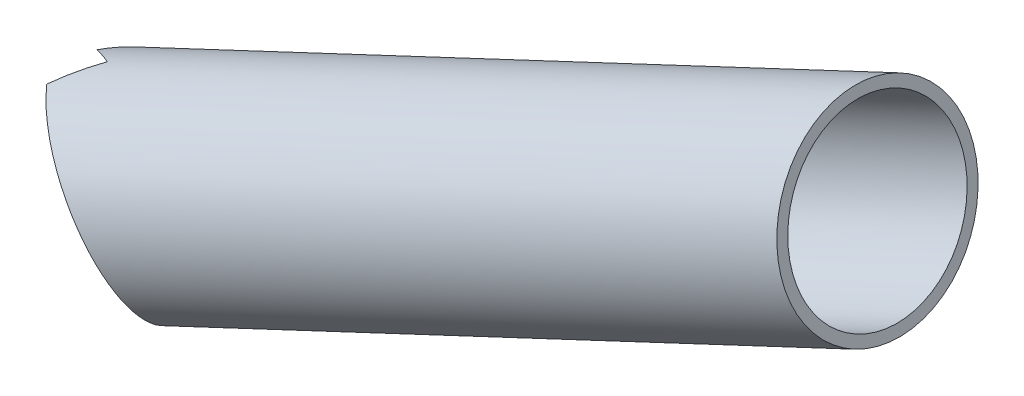
ISO-10303-21;
HEADER;
FILE_DESCRIPTION(('STEP AP214'),'2;1');
FILE_NAME('part.step','',(''),(''),'','','');
FILE_SCHEMA(('AUTOMOTIVE_DESIGN { 1 0 10303 214 1 1 1 1 }'));
ENDSEC;
DATA;
#1=APPLICATION_CONTEXT('core data for automotive mechanical design processes');
#2=APPLICATION_PROTOCOL_DEFINITION('international standard','automotive_design',2000,#1);
#3=PRODUCT_CONTEXT('',#1,'mechanical');
#4=PRODUCT('Part','Part','',(#3));
#5=PRODUCT_RELATED_PRODUCT_CATEGORY('part','',(#4));
#6=PRODUCT_DEFINITION_FORMATION('','',#4);
#7=PRODUCT_DEFINITION_CONTEXT('part definition',#1,'design');
#8=PRODUCT_DEFINITION('design','',#6,#7);
#9=PRODUCT_DEFINITION_SHAPE('','',#8);
#10=(LENGTH_UNIT() NAMED_UNIT(*) SI_UNIT(.MILLI.,.METRE.));
#11=(NAMED_UNIT(*) PLANE_ANGLE_UNIT() SI_UNIT($,.RADIAN.));
#12=(NAMED_UNIT(*) SI_UNIT($,.STERADIAN.) SOLID_ANGLE_UNIT());
#13=UNCERTAINTY_MEASURE_WITH_UNIT(LENGTH_MEASURE(1.E-05),#10,'distance_accuracy_value','');
#14=(GEOMETRIC_REPRESENTATION_CONTEXT(3) GLOBAL_UNCERTAINTY_ASSIGNED_CONTEXT((#13)) GLOBAL_UNIT_ASSIGNED_CONTEXT((#10,
#11,#12)) REPRESENTATION_CONTEXT('',''));
#15=CARTESIAN_POINT('',(0.,0.,0.));
#16=DIRECTION('',(0.,0.,1.));
#17=DIRECTION('',(1.,0.,0.));
#18=AXIS2_PLACEMENT_3D('',#15,#16,#17);
#19=CARTESIAN_POINT('',(-150.,499.999999999999,-1140.));
#20=DIRECTION('',(0.904818702200994,0.425797036329879,0.));
#21=DIRECTION('',(-0.425797036329879,0.904818702200994,0.));
#22=AXIS2_PLACEMENT_3D('',#19,#20,#21);
#23=CYLINDRICAL_SURFACE('',#22,9.79999999999998);
#24=CARTESIAN_POINT('',(-64.9999999999999,539.999999999999,-1140.));
#25=DIRECTION('',(0.975914622854119,0.218152810890676,0.));
#26=DIRECTION('',(-0.218152810890676,0.975914622854119,0.));
#27=AXIS2_PLACEMENT_3D('',#24,#25,#26);
#28=ELLIPSE('',#27,10.0418620343441,9.79999999999998);
#29=CARTESIAN_POINT('',(-67.1906604293684,549.799999999999,-1140.));
#30=VERTEX_POINT('',#29);
#31=EDGE_CURVE('E91',#30,#30,#28,.T.);
#32=ORIENTED_EDGE('',*,*,#31,.T.);
#33=EDGE_LOOP('',(#32));
#34=FACE_BOUND('',#33,.T.);
#35=CARTESIAN_POINT('',(-138.336732281427,501.299146111356,-1149.03718128588));
#36=CARTESIAN_POINT('',(-138.384109782549,501.107603912451,-1148.97293399458));
#37=CARTESIAN_POINT('',(-138.434346628037,500.917916336378,-1148.90534939631));
#38=CARTESIAN_POINT('',(-138.539913281016,500.542416929299,-1148.7638179233));
#39=CARTESIAN_POINT('',(-138.595241977368,500.356604263521,-1148.68987243686));
#40=CARTESIAN_POINT('',(-138.710372086181,499.988987744089,-1148.53592426282));
#41=CARTESIAN_POINT('',(-138.770172276178,499.807182812233,-1148.45592323069));
#42=CARTESIAN_POINT('',(-138.893673155196,499.447627793085,-1148.29003767371));
#43=CARTESIAN_POINT('',(-138.957374070782,499.269877942151,-1148.20415280709));
#44=CARTESIAN_POINT('',(-139.153825821032,498.741876961192,-1147.93738142296));
#45=CARTESIAN_POINT('',(-139.291615312254,498.397847071443,-1147.7477864734));
#46=CARTESIAN_POINT('',(-139.57572163373,497.727394240218,-1147.34544038017));
#47=CARTESIAN_POINT('',(-139.722036930919,497.400968153523,-1147.13269339364));
#48=CARTESIAN_POINT('',(-139.950661082281,496.910340755046,-1146.78386617308));
#49=CARTESIAN_POINT('',(-140.032041704513,496.739438502688,-1146.65654059522));
#50=CARTESIAN_POINT('',(-140.194365856337,496.403822656739,-1146.3937114018));
#51=CARTESIAN_POINT('',(-140.275309426939,496.239108473556,-1146.25820856859));
#52=CARTESIAN_POINT('',(-140.435269439397,495.916446829234,-1145.97812295777));
#53=CARTESIAN_POINT('',(-140.514285072907,495.758502186121,-1145.83353645939));
#54=CARTESIAN_POINT('',(-140.66836681663,495.450464881985,-1145.53421188882));
#55=CARTESIAN_POINT('',(-140.743433571272,495.300370939805,-1145.37947548234));
#56=CARTESIAN_POINT('',(-140.8698428819,495.044328599867,-1145.09681231914));
#57=CARTESIAN_POINT('',(-140.922570084574,494.936397367509,-1144.97130724133));
#58=CARTESIAN_POINT('',(-141.022745519367,494.72698374187,-1144.71295129274));
#59=CARTESIAN_POINT('',(-141.070193487935,494.625501670657,-1144.58010005572));
#60=CARTESIAN_POINT('',(-141.15793490945,494.430630767345,-1144.30692109174));
#61=CARTESIAN_POINT('',(-141.198249228381,494.337218754685,-1144.16661678466));
#62=CARTESIAN_POINT('',(-141.26995057508,494.159897893305,-1143.87797284965));
#63=CARTESIAN_POINT('',(-141.301342934248,494.07598338738,-1143.72963808376));
#64=CARTESIAN_POINT('',(-141.347303838552,493.937823215201,-1143.4607313347));
#65=CARTESIAN_POINT('',(-141.364088319109,493.88122140646,-1143.34174822431));
#66=CARTESIAN_POINT('',(-141.390678531993,493.775639243531,-1143.099741564));
#67=CARTESIAN_POINT('',(-141.400488059221,493.7266547563,-1142.97672024934));
#68=CARTESIAN_POINT('',(-141.412785788239,493.637036390859,-1142.72736039369));
#69=CARTESIAN_POINT('',(-141.415276739653,493.596399381801,-1142.60102311652));
#70=CARTESIAN_POINT('',(-141.412990748526,493.523931591068,-1142.3459105694));
#71=CARTESIAN_POINT('',(-141.408213497327,493.492101183449,-1142.21713519614));
#72=CARTESIAN_POINT('',(-141.391869289207,493.437507707597,-1141.95865098935));
#73=CARTESIAN_POINT('',(-141.380329456989,493.414709021996,-1141.8289479183));
#74=CARTESIAN_POINT('',(-141.351236309292,493.377816562473,-1141.56895962746));
#75=CARTESIAN_POINT('',(-141.333680413293,493.363726531308,-1141.43867418156));
#76=CARTESIAN_POINT('',(-141.273333628975,493.333928228905,-1141.04773668461));
#77=CARTESIAN_POINT('',(-141.222882505429,493.330742352202,-1140.78725175076));
#78=CARTESIAN_POINT('',(-141.116678588816,493.351790979125,-1140.30343581381));
#79=CARTESIAN_POINT('',(-141.06240469889,493.37260644476,-1140.07957463281));
#80=CARTESIAN_POINT('',(-140.948681119689,493.433253383847,-1139.63565295896));
#81=CARTESIAN_POINT('',(-140.889227692982,493.473098683266,-1139.4155953502));
#82=CARTESIAN_POINT('',(-140.768429845456,493.569576889879,-1138.97903926638));
#83=CARTESIAN_POINT('',(-140.707080233731,493.626260373711,-1138.76255361831));
#84=CARTESIAN_POINT('',(-140.585306943385,493.754539107633,-1138.33385760049));
#85=CARTESIAN_POINT('',(-140.52488314064,493.82613233962,-1138.1216466564));
#86=CARTESIAN_POINT('',(-140.38457393457,494.012733069873,-1137.62146505655));
#87=CARTESIAN_POINT('',(-140.306033384434,494.133893651101,-1137.3353976641));
#88=CARTESIAN_POINT('',(-140.158813234301,494.399598187824,-1136.77162256489));
#89=CARTESIAN_POINT('',(-140.090137032202,494.544150164487,-1136.49391776464));
#90=CARTESIAN_POINT('',(-139.966050916874,494.85465186944,-1135.94813957733));
#91=CARTESIAN_POINT('',(-139.910623551443,495.020573000356,-1135.68005391963));
#92=CARTESIAN_POINT('',(-139.815725812232,495.372514235599,-1135.15450818514));
#93=CARTESIAN_POINT('',(-139.77625108119,495.55852883403,-1134.89704522417));
#94=CARTESIAN_POINT('',(-139.720574421837,495.917784490671,-1134.43506653046));
#95=CARTESIAN_POINT('',(-139.701644887835,496.08824291451,-1134.22871112874));
#96=CARTESIAN_POINT('',(-139.677999290444,496.441501023387,-1133.82600834396));
#97=CARTESIAN_POINT('',(-139.673280716276,496.624298522533,-1133.62965919903));
#98=CARTESIAN_POINT('',(-139.679189248526,497.001212712988,-1133.24847083722));
#99=CARTESIAN_POINT('',(-139.689811712888,497.195325963202,-1133.06362815623));
#100=CARTESIAN_POINT('',(-139.72734287811,497.593747421134,-1132.70700138034));
#101=CARTESIAN_POINT('',(-139.754251705322,497.798055707936,-1132.53521738675));
#102=CARTESIAN_POINT('',(-139.825307380399,498.216870298143,-1132.20529448174));
#103=CARTESIAN_POINT('',(-139.86957001237,498.431436417195,-1132.04725612005));
#104=CARTESIAN_POINT('',(-139.975743242526,498.867768451591,-1131.74788165695));
#105=CARTESIAN_POINT('',(-140.037654049417,499.089534452053,-1131.60654575309));
#106=CARTESIAN_POINT('',(-140.17913343238,499.538193376268,-1131.34229140873));
#107=CARTESIAN_POINT('',(-140.258692675098,499.765083533361,-1131.21936329065));
#108=CARTESIAN_POINT('',(-140.435124558774,500.221950393892,-1130.99327873866));
#109=CARTESIAN_POINT('',(-140.531995120511,500.451926723592,-1130.89011993338));
#110=CARTESIAN_POINT('',(-140.729921307743,500.885685015895,-1130.7155663093));
#111=CARTESIAN_POINT('',(-140.829154026388,501.089376165319,-1130.64186521179));
#112=CARTESIAN_POINT('',(-141.039699649425,501.495877975374,-1130.51125662004));
#113=CARTESIAN_POINT('',(-141.1510114463,501.698688714957,-1130.45434758793));
#114=CARTESIAN_POINT('',(-141.384718272532,502.101949087778,-1130.35760347387));
#115=CARTESIAN_POINT('',(-141.507112472077,502.302398896526,-1130.31776711487));
#116=CARTESIAN_POINT('',(-141.761845980118,502.699608321355,-1130.25519549696));
#117=CARTESIAN_POINT('',(-141.894185512907,502.896367854085,-1130.23246062386));
#118=CARTESIAN_POINT('',(-142.165133751504,503.281567527469,-1130.20416002853));
#119=CARTESIAN_POINT('',(-142.303590472553,503.4700932238,-1130.198298193));
#120=CARTESIAN_POINT('',(-142.587689921144,503.841550764897,-1130.20255114103));
#121=CARTESIAN_POINT('',(-142.733335154833,504.024480622252,-1130.21267153518));
#122=CARTESIAN_POINT('',(-143.030439891601,504.383840200172,-1130.24841679835));
#123=CARTESIAN_POINT('',(-143.181896866452,504.560272683211,-1130.27403499553));
#124=CARTESIAN_POINT('',(-143.489494968056,504.906220088448,-1130.34022612203));
#125=CARTESIAN_POINT('',(-143.64563807618,505.07573201094,-1130.38080546138));
#126=CARTESIAN_POINT('',(-143.977831875718,505.424709209585,-1130.48131889087));
#127=CARTESIAN_POINT('',(-144.154257442382,505.603362807276,-1130.54283271095));
#128=CARTESIAN_POINT('',(-144.509583322142,505.951300125166,-1130.68255864086));
#129=CARTESIAN_POINT('',(-144.688482996794,506.12058620827,-1130.7607665153));
#130=CARTESIAN_POINT('',(-145.047523456281,506.450052055816,-1130.93330007403));
#131=CARTESIAN_POINT('',(-145.227665861119,506.610215429646,-1131.02765362059));
#132=CARTESIAN_POINT('',(-145.587204554633,506.921199718396,-1131.23171970656));
#133=CARTESIAN_POINT('',(-145.766600995042,507.072022629627,-1131.34142894758));
#134=CARTESIAN_POINT('',(-146.152667284849,507.389064734939,-1131.59526030083));
#135=CARTESIAN_POINT('',(-146.358904286496,507.553665618834,-1131.74207073006));
#136=CARTESIAN_POINT('',(-146.765068680726,507.871534156218,-1132.05557247906));
#137=CARTESIAN_POINT('',(-146.964993521092,508.024797258268,-1132.22227171359));
#138=CARTESIAN_POINT('',(-147.354372029067,508.321005987237,-1132.57530646318));
#139=CARTESIAN_POINT('',(-147.543838773257,508.463964570452,-1132.76161656861));
#140=CARTESIAN_POINT('',(-147.907228057707,508.741392350299,-1133.15431032563));
#141=CARTESIAN_POINT('',(-148.081163346731,508.8758684825,-1133.36067721782));
#142=CARTESIAN_POINT('',(-148.412918309111,509.1441278914,-1133.80327272173));
#143=CARTESIAN_POINT('',(-148.569810919142,509.277666711291,-1134.04036745157));
#144=CARTESIAN_POINT('',(-148.777338062252,509.475114660886,-1134.41268892875));
#145=CARTESIAN_POINT('',(-148.841846475094,509.540413559266,-1134.53949058014));
#146=CARTESIAN_POINT('',(-148.959744813563,509.670438653079,-1134.79840590481));
#147=CARTESIAN_POINT('',(-149.013141524125,509.735165174753,-1134.93051627738));
#148=CARTESIAN_POINT('',(-149.099825862611,509.854533092843,-1135.17913969417));
#149=CARTESIAN_POINT('',(-149.134932608085,509.909221170316,-1135.29499480444));
#150=CARTESIAN_POINT('',(-149.194659894054,510.018378942217,-1135.52943519284));
#151=CARTESIAN_POINT('',(-149.219285424401,510.072848728305,-1135.64801914341));
#152=CARTESIAN_POINT('',(-149.257235105689,510.181454040522,-1135.88698628407));
#153=CARTESIAN_POINT('',(-149.270571562427,510.235589866596,-1136.00736736906));
#154=CARTESIAN_POINT('',(-149.285613699637,510.34339253966,-1136.24906563634));
#155=CARTESIAN_POINT('',(-149.287319198416,510.397059379309,-1136.37038283322));
#156=CARTESIAN_POINT('',(-149.279250401041,510.503531475811,-1136.61269195166));
#157=CARTESIAN_POINT('',(-149.269500970609,510.556338347535,-1136.73368400845));
#158=CARTESIAN_POINT('',(-149.239194858499,510.660914563714,-1136.97478131758));
#159=CARTESIAN_POINT('',(-149.21863360642,510.712683459777,-1137.0948861731));
#160=CARTESIAN_POINT('',(-149.142064306163,510.866114659875,-1137.45316716174));
#161=CARTESIAN_POINT('',(-149.071181560786,510.965799469893,-1137.68907746012));
#162=CARTESIAN_POINT('',(-148.908237783641,511.147716998076,-1138.12754211656));
#163=CARTESIAN_POINT('',(-148.819216630602,511.230679727555,-1138.3309821867));
#164=CARTESIAN_POINT('',(-148.622739390114,511.390236315637,-1138.73148939223));
#165=CARTESIAN_POINT('',(-148.515268100475,511.466824844258,-1138.92855111167));
#166=CARTESIAN_POINT('',(-148.285605799954,511.613622842151,-1139.31836808921));
#167=CARTESIAN_POINT('',(-148.163314715713,511.683782603359,-1139.5110823079));
#168=CARTESIAN_POINT('',(-147.907959803507,511.816771431814,-1139.89176388563));
#169=CARTESIAN_POINT('',(-147.77489694554,511.879601157888,-1140.07973167009));
#170=CARTESIAN_POINT('',(-147.489542550938,512.00228732185,-1140.46653095151));
#171=CARTESIAN_POINT('',(-147.33656212829,512.061518678894,-1140.66505038945));
#172=CARTESIAN_POINT('',(-147.022946416122,512.17070207489,-1141.05860951802));
#173=CARTESIAN_POINT('',(-146.862309531261,512.220652169234,-1141.25364847169));
#174=CARTESIAN_POINT('',(-146.534866700256,512.31081658541,-1141.64101948947));
#175=CARTESIAN_POINT('',(-146.368056350982,512.351023797774,-1141.83334948102));
#176=CARTESIAN_POINT('',(-146.029593390326,512.421100018271,-1142.21561693414));
#177=CARTESIAN_POINT('',(-145.857940792191,512.450969054685,-1142.40555440225));
#178=CARTESIAN_POINT('',(-145.515978549459,512.498992899382,-1142.77765278441));
#179=CARTESIAN_POINT('',(-145.345782599279,512.517471692971,-1142.9598762548));
#180=CARTESIAN_POINT('',(-145.002559391186,512.543409660717,-1143.32240883479));
#181=CARTESIAN_POINT('',(-144.829532392462,512.550869838004,-1143.50271811718));
#182=CARTESIAN_POINT('',(-144.481508322448,512.554000971222,-1143.86125054756));
#183=CARTESIAN_POINT('',(-144.306513082177,512.549682105982,-1144.03947536315));
#184=CARTESIAN_POINT('',(-143.955080934561,512.528371299434,-1144.39384073409));
#185=CARTESIAN_POINT('',(-143.778643564301,512.511375117003,-1144.56998057188));
#186=CARTESIAN_POINT('',(-143.601881633929,512.487588485425,-1144.7449399659));
#187=B_SPLINE_CURVE_WITH_KNOTS('',3,(#35,#36,#37,#38,#39,#40,#41,#42,#43,#44,#45,#46,#47,#48,
#49,#50,#51,#52,#53,#54,#55,#56,#57,#58,#59,#60,#61,#62,#63,#64,#65,#66,#67,#68,#69,#70,#71,#72,
#73,#74,#75,#76,#77,#78,#79,#80,#81,#82,#83,#84,#85,#86,#87,#88,#89,#90,#91,#92,#93,#94,#95,#96,
#97,#98,#99,#100,#101,#102,#103,#104,#105,#106,#107,#108,#109,#110,#111,#112,#113,#114,#115,
#116,#117,#118,#119,#120,#121,#122,#123,#124,#125,#126,#127,#128,#129,#130,#131,#132,#133,#134,
#135,#136,#137,#138,#139,#140,#141,#142,#143,#144,#145,#146,#147,#148,#149,#150,#151,#152,#153,
#154,#155,#156,#157,#158,#159,#160,#161,#162,#163,#164,#165,#166,#167,#168,#169,#170,#171,#172,
#173,#174,#175,#176,#177,#178,#179,#180,#181,#182,#183,#184,#185,#186),.UNSPECIFIED.,.F.,.F.,(4,
2,2,2,2,2,2,2,2,2,2,2,2,2,2,2,2,2,2,2,2,2,2,2,2,2,2,2,2,2,2,2,2,2,2,2,2,2,2,2,2,2,2,2,2,2,2,2,2,
2,2,2,2,2,2,2,2,2,2,2,2,2,2,2,2,2,2,2,2,2,2,2,2,2,2,4),(0.,0.622439566958445,1.24474362652316,
1.86687817201632,2.48904888751746,3.73668036522004,4.98408818870272,5.66828335120571,
6.35241315835265,7.03682504298889,7.72112488776553,8.24201521392334,8.76293153257506,
9.28229803091212,9.80135352124916,10.1994106881417,10.5972511159027,10.9949420540164,
11.3926498812977,11.7887733169389,12.185066878141,12.9784082256457,13.671351916645,
14.3647998277685,15.0603520712831,15.7558102296968,16.7159379080137,17.6763955252002,
18.635580907627,19.594504123171,20.3986853129396,21.2027244123918,22.0065202679844,
22.8103223595747,23.6195812456197,24.4288497022689,25.2376911942563,26.0464356034497,
26.7603404808185,27.4741799563301,28.1879660261317,28.9017681985033,29.60296477507,
30.3044075624976,31.0055485923562,31.7069903721784,32.4817518507352,33.2563170005305,
34.032232536879,34.8079816625349,35.712907290195,36.6181942417072,37.5223223316636,
38.4257013251282,39.3653399861501,39.8345665276575,40.3035057078038,40.701618055668,
41.0995406594149,41.4970289420156,41.8945234339633,42.2911566587592,42.6879576843323,
43.4823128814373,44.192498422446,44.903271962022,45.6191448728801,46.3349533910024,
47.1072036552805,47.8796155392942,48.6525893732081,49.4255610924961,50.1753872326419,
50.9251451046147,51.6742552804987,52.423616179329),.UNSPECIFIED.);
#188=CARTESIAN_POINT('',(-141.320591496933,493.357491951229,-1141.35457940892));
#189=VERTEX_POINT('',#188);
#190=CARTESIAN_POINT('',(-147.810808037471,511.861066686141,-1140.02674104806));
#191=VERTEX_POINT('',#190);
#192=EDGE_CURVE('E83',#189,#191,#187,.T.);
#193=ORIENTED_EDGE('',*,*,#192,.T.);
#194=CARTESIAN_POINT('',(-145.166809343206,512.727009569949,-1137.43244739321));
#195=CARTESIAN_POINT('',(-145.317586623332,512.69442281405,-1137.56037692525));
#196=CARTESIAN_POINT('',(-145.467120842229,512.659648894768,-1137.68922644219));
#197=CARTESIAN_POINT('',(-145.763253034068,512.585868058034,-1137.94913540009));
#198=CARTESIAN_POINT('',(-145.909850353182,512.546860210139,-1138.08019532143));
#199=CARTESIAN_POINT('',(-146.20079507228,512.464426400729,-1138.34593805173));
#200=CARTESIAN_POINT('',(-146.345113671274,512.420966433929,-1138.48064191045));
#201=CARTESIAN_POINT('',(-146.62956741496,512.330029869832,-1138.75306534433));
#202=CARTESIAN_POINT('',(-146.769702844945,512.282553547301,-1138.89078471272));
#203=CARTESIAN_POINT('',(-147.052448978068,512.180996096573,-1139.17740418858));
#204=CARTESIAN_POINT('',(-147.194778958147,512.126696091507,-1139.32650476827));
#205=CARTESIAN_POINT('',(-147.472563613681,512.013837809595,-1139.62951520709));
#206=CARTESIAN_POINT('',(-147.608016910162,511.955278684355,-1139.78342602089));
#207=CARTESIAN_POINT('',(-147.869775865997,511.834209879729,-1140.09642368117));
#208=CARTESIAN_POINT('',(-147.996111163215,511.771714362971,-1140.25549107293));
#209=CARTESIAN_POINT('',(-148.237682010634,511.642716011877,-1140.58023024677));
#210=CARTESIAN_POINT('',(-148.352923818656,511.576215471597,-1140.74589822999));
#211=CARTESIAN_POINT('',(-148.544692348507,511.454806486202,-1141.04645886904));
#212=CARTESIAN_POINT('',(-148.624079485351,511.400679089818,-1141.17983486621));
#213=CARTESIAN_POINT('',(-148.772504018297,511.290170408017,-1141.45141296606));
#214=CARTESIAN_POINT('',(-148.841539876438,511.233788789248,-1141.58961578213));
#215=CARTESIAN_POINT('',(-148.966483420868,511.119568521706,-1141.86919329454));
#216=CARTESIAN_POINT('',(-149.022529464223,511.061753259811,-1142.01051513973));
#217=CARTESIAN_POINT('',(-149.120453798913,510.9442720026,-1142.297254745));
#218=CARTESIAN_POINT('',(-149.162335906439,510.884606510529,-1142.44267139036));
#219=CARTESIAN_POINT('',(-149.225339850178,510.772480882488,-1142.71504986442));
#220=CARTESIAN_POINT('',(-149.248599396986,510.7202399598,-1142.84160788567));
#221=CARTESIAN_POINT('',(-149.283008565666,510.614704189503,-1143.09591942452));
#222=CARTESIAN_POINT('',(-149.294159616899,510.561409467047,-1143.22367279921));
#223=CARTESIAN_POINT('',(-149.304299764433,510.453736362476,-1143.47951051949));
#224=CARTESIAN_POINT('',(-149.30326365894,510.399355967049,-1143.60759500313));
#225=CARTESIAN_POINT('',(-149.289451161879,510.289617203664,-1143.86271927275));
#226=CARTESIAN_POINT('',(-149.276671861436,510.234258596728,-1143.98975879203));
#227=CARTESIAN_POINT('',(-149.235452467052,510.107728543845,-1144.27507588567));
#228=CARTESIAN_POINT('',(-149.203768432373,510.036241018779,-1144.43274552741));
#229=CARTESIAN_POINT('',(-149.125397304491,509.891256809735,-1144.74334215198));
#230=CARTESIAN_POINT('',(-149.078705210532,509.817759463554,-1144.89626753535));
#231=CARTESIAN_POINT('',(-148.972634515461,509.668125549409,-1145.19684703044));
#232=CARTESIAN_POINT('',(-148.913221404332,509.591982283862,-1145.34448550183));
#233=CARTESIAN_POINT('',(-148.784023543284,509.436768479402,-1145.63357332562));
#234=CARTESIAN_POINT('',(-148.714235233032,509.35769694265,-1145.77502053178));
#235=CARTESIAN_POINT('',(-148.52657152432,509.152894090813,-1146.12553052865));
#236=CARTESIAN_POINT('',(-148.402970366449,509.024868669907,-1146.33020114489));
#237=CARTESIAN_POINT('',(-148.141454951273,508.759535729286,-1146.72380864397));
#238=CARTESIAN_POINT('',(-148.003533754041,508.622223720351,-1146.91273781733));
#239=CARTESIAN_POINT('',(-147.717472113123,508.337355170455,-1147.27453476867));
#240=CARTESIAN_POINT('',(-147.569328966348,508.189795919649,-1147.44739826967));
#241=CARTESIAN_POINT('',(-147.266061164232,507.883872333657,-1147.77655896599));
#242=CARTESIAN_POINT('',(-147.110937603405,507.725509690423,-1147.93285874565));
#243=CARTESIAN_POINT('',(-146.79115479051,507.392319936093,-1148.23315341612));
#244=CARTESIAN_POINT('',(-146.626349410688,507.21712578707,-1148.37658615857));
#245=CARTESIAN_POINT('',(-146.29441609869,506.854795321708,-1148.64446532561));
#246=CARTESIAN_POINT('',(-146.127288063756,506.667658475679,-1148.76891090723));
#247=CARTESIAN_POINT('',(-145.792939082886,506.281772667539,-1148.99787881483));
#248=CARTESIAN_POINT('',(-145.62571819614,506.083028131626,-1149.10240867104));
#249=CARTESIAN_POINT('',(-145.293137445893,505.674417592604,-1149.2906605201));
#250=CARTESIAN_POINT('',(-145.127777573675,505.464551641612,-1149.37438261045));
#251=CARTESIAN_POINT('',(-144.796477647132,505.028809808217,-1149.52203537007));
#252=CARTESIAN_POINT('',(-144.630639758753,504.802656204132,-1149.58537859043));
#253=CARTESIAN_POINT('',(-144.304957228149,504.340780528047,-1149.6882412777));
#254=CARTESIAN_POINT('',(-144.145112795562,504.10505812195,-1149.727759912));
#255=CARTESIAN_POINT('',(-143.833402674301,503.625740905835,-1149.78222860708));
#256=CARTESIAN_POINT('',(-143.681534046879,503.382149049576,-1149.79718777935));
#257=CARTESIAN_POINT('',(-143.387520146412,502.888928493683,-1149.80209023605));
#258=CARTESIAN_POINT('',(-143.245373821151,502.639300451298,-1149.79203623199));
#259=CARTESIAN_POINT('',(-142.985625016718,502.160511243029,-1149.74896806435));
#260=CARTESIAN_POINT('',(-142.8669783534,501.931705279461,-1149.71826825602));
#261=CARTESIAN_POINT('',(-142.63996148486,501.47264852847,-1149.63650078788));
#262=CARTESIAN_POINT('',(-142.531590556515,501.242397843933,-1149.58543456261));
#263=CARTESIAN_POINT('',(-142.325987051523,500.782286085418,-1149.46334466969));
#264=CARTESIAN_POINT('',(-142.228751976196,500.552424935484,-1149.39232549151));
#265=CARTESIAN_POINT('',(-142.046016771479,500.094837263342,-1149.23095710114));
#266=CARTESIAN_POINT('',(-141.960516585866,499.867110730912,-1149.14060798157));
#267=CARTESIAN_POINT('',(-141.804795271394,499.424507707271,-1148.94537116876));
#268=CARTESIAN_POINT('',(-141.73410309319,499.209479512826,-1148.84120108045));
#269=CARTESIAN_POINT('',(-141.604050279966,498.784511816816,-1148.61670061332));
#270=CARTESIAN_POINT('',(-141.54468922357,498.574572126276,-1148.49637083572));
#271=CARTESIAN_POINT('',(-141.437247560038,498.161192480017,-1148.24054778283));
#272=CARTESIAN_POINT('',(-141.389165682066,497.957751794283,-1148.10505621837));
#273=CARTESIAN_POINT('',(-141.304024739585,497.558625776724,-1147.81993351139));
#274=CARTESIAN_POINT('',(-141.266966109079,497.362940750516,-1147.67030181246));
#275=CARTESIAN_POINT('',(-141.201882790914,496.971112121611,-1147.35027132142));
#276=CARTESIAN_POINT('',(-141.174391471914,496.775418444374,-1147.17921337805));
#277=CARTESIAN_POINT('',(-141.130364108684,496.395132997708,-1146.82386949127));
#278=CARTESIAN_POINT('',(-141.113828486286,496.210541656005,-1146.63958303882));
#279=CARTESIAN_POINT('',(-141.090770706749,495.853421004787,-1146.25864442742));
#280=CARTESIAN_POINT('',(-141.084261542205,495.68090762196,-1146.06197656697));
#281=CARTESIAN_POINT('',(-141.080122275007,495.349384763895,-1145.65749892641));
#282=CARTESIAN_POINT('',(-141.082492173863,495.190375290954,-1145.4496891444));
#283=CARTESIAN_POINT('',(-141.095259868797,494.871896145764,-1145.00246645403));
#284=CARTESIAN_POINT('',(-141.106437360329,494.713973058422,-1144.76197212945));
#285=CARTESIAN_POINT('',(-141.135296775217,494.417762631794,-1144.2694242165));
#286=CARTESIAN_POINT('',(-141.152980969319,494.279482170882,-1144.01736661962));
#287=CARTESIAN_POINT('',(-141.191537752143,494.025099695622,-1143.50288439511));
#288=CARTESIAN_POINT('',(-141.212406475478,493.908971172615,-1143.24047261792));
#289=CARTESIAN_POINT('',(-141.252903828576,493.701817345392,-1142.70588858718));
#290=CARTESIAN_POINT('',(-141.272533449425,493.610771777527,-1142.43372441434));
#291=CARTESIAN_POINT('',(-141.297206893547,493.492411826687,-1142.00573209991));
#292=CARTESIAN_POINT('',(-141.304834945731,493.454880987426,-1141.85284782075));
#293=CARTESIAN_POINT('',(-141.316580209617,493.389452556,-1141.54491773402));
#294=CARTESIAN_POINT('',(-141.320698674364,493.361551527777,-1141.38987271802));
#295=CARTESIAN_POINT('',(-141.32401189092,493.316319435667,-1141.07854936106));
#296=CARTESIAN_POINT('',(-141.323218522651,493.298962980007,-1140.92227490818));
#297=CARTESIAN_POINT('',(-141.315244327726,493.275584403185,-1140.60900469705));
#298=CARTESIAN_POINT('',(-141.308063508964,493.269562268019,-1140.45200893971));
#299=CARTESIAN_POINT('',(-141.285746849156,493.269546991865,-1140.13627365275));
#300=CARTESIAN_POINT('',(-141.270498072464,493.2757281161,-1139.97754152174));
#301=CARTESIAN_POINT('',(-141.230855145032,493.300789927038,-1139.66223341908));
#302=CARTESIAN_POINT('',(-141.206462236914,493.319668888473,-1139.50565715746));
#303=CARTESIAN_POINT('',(-141.148040332357,493.369838576401,-1139.19649371582));
#304=CARTESIAN_POINT('',(-141.114020530017,493.401117471797,-1139.0439028807));
#305=CARTESIAN_POINT('',(-141.036545554252,493.475220556988,-1138.74401661137));
#306=CARTESIAN_POINT('',(-140.993088982292,493.518046458282,-1138.59672196584));
#307=CARTESIAN_POINT('',(-140.892603828043,493.618934981505,-1138.29341620844));
#308=CARTESIAN_POINT('',(-140.834633434286,493.678119504348,-1138.1380934112));
#309=CARTESIAN_POINT('',(-140.709848595664,493.807007341032,-1137.83561499006));
#310=CARTESIAN_POINT('',(-140.643031955333,493.876713266684,-1137.68846140651));
#311=CARTESIAN_POINT('',(-140.501628967714,494.025535615378,-1137.40070896064));
#312=CARTESIAN_POINT('',(-140.426970497582,494.104740553141,-1137.26019200315));
#313=CARTESIAN_POINT('',(-140.272145927036,494.270392665809,-1136.98674570612));
#314=CARTESIAN_POINT('',(-140.19198030836,494.356839207399,-1136.85381570476));
#315=CARTESIAN_POINT('',(-140.02117672295,494.542697232834,-1136.5847079456));
#316=CARTESIAN_POINT('',(-139.93020876891,494.642594252111,-1136.44907800514));
#317=CARTESIAN_POINT('',(-139.744923931873,494.848281224895,-1136.18471215121));
#318=CARTESIAN_POINT('',(-139.650606053697,494.954072934966,-1136.05597831537));
#319=CARTESIAN_POINT('',(-139.459592829959,495.170916857137,-1135.80434518621));
#320=CARTESIAN_POINT('',(-139.362893473761,495.281978283495,-1135.68145692597));
#321=CARTESIAN_POINT('',(-139.168163122359,495.50861967997,-1135.44101366187));
#322=CARTESIAN_POINT('',(-139.070132027178,495.624199990566,-1135.32345906134));
#323=CARTESIAN_POINT('',(-138.877713517385,495.854373611896,-1135.09807426091));
#324=CARTESIAN_POINT('',(-138.783352193302,495.968792839505,-1134.99004340249));
#325=CARTESIAN_POINT('',(-138.59456848706,496.201150012126,-1134.77788242113));
#326=CARTESIAN_POINT('',(-138.500146102492,496.319088105398,-1134.67375246295));
#327=CARTESIAN_POINT('',(-138.31212795442,496.557727375064,-1134.46954415017));
#328=CARTESIAN_POINT('',(-138.218530398433,496.678412580777,-1134.36944875439));
#329=CARTESIAN_POINT('',(-138.032078021523,496.922960503052,-1134.17254844027));
#330=CARTESIAN_POINT('',(-137.93922309528,497.046822758176,-1134.07574304878));
#331=CARTESIAN_POINT('',(-137.846911788141,497.172227265434,-1133.98045025076));
#332=B_SPLINE_CURVE_WITH_KNOTS('',3,(#194,#195,#196,#197,#198,#199,#200,#201,#202,#203,#204,
#205,#206,#207,#208,#209,#210,#211,#212,#213,#214,#215,#216,#217,#218,#219,#220,#221,#222,#223,
#224,#225,#226,#227,#228,#229,#230,#231,#232,#233,#234,#235,#236,#237,#238,#239,#240,#241,#242,
#243,#244,#245,#246,#247,#248,#249,#250,#251,#252,#253,#254,#255,#256,#257,#258,#259,#260,#261,
#262,#263,#264,#265,#266,#267,#268,#269,#270,#271,#272,#273,#274,#275,#276,#277,#278,#279,#280,
#281,#282,#283,#284,#285,#286,#287,#288,#289,#290,#291,#292,#293,#294,#295,#296,#297,#298,#299,
#300,#301,#302,#303,#304,#305,#306,#307,#308,#309,#310,#311,#312,#313,#314,#315,#316,#317,#318,
#319,#320,#321,#322,#323,#324,#325,#326,#327,#328,#329,#330,#331),.UNSPECIFIED.,.F.,.F.,(4,2,2,
2,2,2,2,2,2,2,2,2,2,2,2,2,2,2,2,2,2,2,2,2,2,2,2,2,2,2,2,2,2,2,2,2,2,2,2,2,2,2,2,2,2,2,2,2,2,2,2,
2,2,2,2,2,2,2,2,2,2,2,2,2,2,2,2,2,4),(0.,0.601204665596559,1.20254171976839,1.80887341105245,
2.41516365551216,3.05446772250859,3.69389948616214,4.33114927232066,4.96803745409853,
5.46084139260228,5.95371847799399,6.44107613160814,6.92830237155142,7.34442384261944,
7.76049618681938,8.17742907713412,8.59446527265599,9.12160638737681,9.64892333041082,
10.1776893442444,10.7066372289645,11.519081732621,12.3319218258855,13.1449776962264,
13.9579065223831,14.7971522308357,15.6364351878953,16.4754001762239,17.3143612333544,
18.1756994955554,19.0370678574458,19.8981165819225,20.7590719696993,21.5367697239369,
22.3144127094296,23.0918808629473,23.8693452914677,24.6160151215478,25.3626571794516,
26.1092150720782,26.8558023540904,27.6390742120173,28.4223762268258,29.2066924173154,
29.9910087412457,30.8538194867987,31.7169316269739,32.5790043327239,33.4403785438857,
33.9129201694576,34.3852930106021,34.8565238022888,35.3277540117053,35.8057621722167,
36.2837053983628,36.761193699819,37.2387528136688,37.7660148355484,38.2934079597575,
38.8261659634001,39.3588774232783,39.9329080009645,40.5071105590728,41.0823570550573,
41.6576469774351,42.2080192054186,42.7584146550254,43.306169536489,43.8538453069924),.UNSPECIFIED.);
#333=EDGE_CURVE('E81',#191,#189,#332,.T.);
#334=ORIENTED_EDGE('',*,*,#333,.T.);
#335=EDGE_LOOP('',(#193,#334));
#336=FACE_BOUND('',#335,.T.);
#337=ADVANCED_FACE('F41',(#34,#336),#23,.F.);
#338=CARTESIAN_POINT('',(-65.,540.,-1140.));
#339=DIRECTION('',(0.975914622854119,0.218152810890676,0.));
#340=DIRECTION('',(-0.218152810890676,0.975914622854119,0.));
#341=AXIS2_PLACEMENT_3D('',#338,#339,#340);
#342=PLANE('',#341);
#343=ORIENTED_EDGE('',*,*,#31,.F.);
#344=EDGE_LOOP('',(#343));
#345=FACE_BOUND('',#344,.T.);
#346=CARTESIAN_POINT('',(-64.9999999999999,539.999999999999,-1140.));
#347=DIRECTION('',(0.975914622854119,0.218152810890676,0.));
#348=DIRECTION('',(-0.218152810890676,0.975914622854119,0.));
#349=AXIS2_PLACEMENT_3D('',#346,#347,#348);
#350=ELLIPSE('',#349,11.2714777936515,11.);
#351=CARTESIAN_POINT('',(-67.4589045635768,550.999999999999,-1140.));
#352=VERTEX_POINT('',#351);
#353=EDGE_CURVE('E90',#352,#352,#350,.T.);
#354=ORIENTED_EDGE('',*,*,#353,.T.);
#355=EDGE_LOOP('',(#354));
#356=FACE_BOUND('',#355,.T.);
#357=ADVANCED_FACE('F43',(#345,#356),#342,.T.);
#358=CARTESIAN_POINT('',(-150.,499.999999999999,-1140.));
#359=DIRECTION('',(0.904818702200994,0.425797036329879,0.));
#360=DIRECTION('',(-0.425797036329879,0.904818702200994,0.));
#361=AXIS2_PLACEMENT_3D('',#358,#359,#360);
#362=CYLINDRICAL_SURFACE('',#361,11.);
#363=ORIENTED_EDGE('',*,*,#353,.F.);
#364=EDGE_LOOP('',(#363));
#365=FACE_BOUND('',#364,.T.);
#366=CARTESIAN_POINT('',(-150.,500.,-1140.));
#367=DIRECTION('',(0.661636513716334,0.0238473310187051,0.749445413969943));
#368=DIRECTION('',(0.632795525843136,0.518432072130128,-0.575150422984954));
#369=AXIS2_PLACEMENT_3D('',#366,#367,#368);
#370=ELLIPSE('',#369,18.0678796082317,11.);
#371=CARTESIAN_POINT('',(-154.424775755789,509.402648481051,-1136.39284585126));
#372=VERTEX_POINT('',#371);
#373=CARTESIAN_POINT('',(-150.868590108601,511.740612569315,-1139.60676434667));
#374=VERTEX_POINT('',#373);
#375=EDGE_CURVE('E11',#372,#374,#370,.F.);
#376=ORIENTED_EDGE('',*,*,#375,.F.);
#377=CARTESIAN_POINT('',(-150.,500.,-1140.));
#378=DIRECTION('',(0.632795525843136,0.518432072130128,-0.575150422984954));
#379=DIRECTION('',(0.661636513716334,0.0238473310187051,0.749445413969943));
#380=AXIS2_PLACEMENT_3D('',#377,#378,#379);
#381=ELLIPSE('',#380,13.8659179246541,11.);
#382=CARTESIAN_POINT('',(-143.569198353222,490.930083364105,-1141.10015248297));
#383=VERTEX_POINT('',#382);
#384=EDGE_CURVE('E74',#383,#372,#381,.F.);
#385=ORIENTED_EDGE('',*,*,#384,.F.);
#386=CARTESIAN_POINT('',(-150.,500.,-1140.));
#387=DIRECTION('',(0.730698843528213,0.456511552407961,0.507618363127858));
#388=DIRECTION('',(0.540188066054772,0.0680580566202291,-0.838787788550288));
#389=AXIS2_PLACEMENT_3D('',#386,#387,#388);
#390=ELLIPSE('',#389,12.8575081968936,11.);
#391=CARTESIAN_POINT('',(-154.592102182703,509.758217138243,-1142.16559364298));
#392=VERTEX_POINT('',#391);
#393=EDGE_CURVE('E86',#392,#383,#390,.F.);
#394=ORIENTED_EDGE('',*,*,#393,.F.);
#395=CARTESIAN_POINT('',(-150.,500.,-1140.));
#396=DIRECTION('',(0.540188066054772,0.0680580566202291,-0.838787788550288));
#397=DIRECTION('',(0.730698843528213,0.456511552407961,0.507618363127858));
#398=AXIS2_PLACEMENT_3D('',#395,#396,#397);
#399=ELLIPSE('',#398,21.2457264159751,11.);
#400=EDGE_CURVE('E49',#374,#392,#399,.F.);
#401=ORIENTED_EDGE('',*,*,#400,.F.);
#402=EDGE_LOOP('',(#376,#385,#394,#401));
#403=FACE_BOUND('',#402,.T.);
#404=ADVANCED_FACE('F85',(#365,#403),#362,.T.);
#405=CARTESIAN_POINT('',(-150.,500.,-1140.));
#406=DIRECTION('',(-0.0991899501072693,-0.396759800429077,0.912547540986877));
#407=DIRECTION('',(0.,-0.917070056253235,-0.39872611141445));
#408=AXIS2_PLACEMENT_3D('',#405,#406,#407);
#409=CYLINDRICAL_SURFACE('',#408,11.);
#410=CARTESIAN_POINT('',(-150.,500.,-1140.));
#411=DIRECTION('',(0.136924020573454,-0.0230393226257373,0.990313587810925));
#412=DIRECTION('',(0.508281006832033,0.859722512143853,-0.0502754433782236));
#413=AXIS2_PLACEMENT_3D('',#410,#411,#412);
#414=ELLIPSE('',#413,12.2321735079949,11.);
#415=EDGE_CURVE('E61',#383,#189,#414,.T.);
#416=ORIENTED_EDGE('',*,*,#415,.F.);
#417=ORIENTED_EDGE('',*,*,#384,.T.);
#418=ORIENTED_EDGE('',*,*,#375,.T.);
#419=EDGE_CURVE('E55',#191,#374,#414,.T.);
#420=ORIENTED_EDGE('',*,*,#419,.F.);
#421=ORIENTED_EDGE('',*,*,#192,.F.);
#422=EDGE_LOOP('',(#416,#417,#418,#420,#421));
#423=FACE_BOUND('',#422,.T.);
#424=ADVANCED_FACE('F72',(#423),#409,.F.);
#425=CARTESIAN_POINT('',(-325.,320.,-1580.));
#426=DIRECTION('',(0.345452680982297,0.355322757581791,0.86856674075549));
#427=DIRECTION('',(0.,-0.925546956205677,0.378632845720504));
#428=AXIS2_PLACEMENT_3D('',#425,#426,#427);
#429=CYLINDRICAL_SURFACE('',#428,11.);
#430=ORIENTED_EDGE('',*,*,#419,.T.);
#431=ORIENTED_EDGE('',*,*,#400,.T.);
#432=ORIENTED_EDGE('',*,*,#393,.T.);
#433=ORIENTED_EDGE('',*,*,#415,.T.);
#434=ORIENTED_EDGE('',*,*,#333,.F.);
#435=EDGE_LOOP('',(#430,#431,#432,#433,#434));
#436=FACE_BOUND('',#435,.T.);
#437=ADVANCED_FACE('F78',(#436),#429,.F.);
#438=CLOSED_SHELL('',(#337,#357,#404,#424,#437));
#439=MANIFOLD_SOLID_BREP('B2',#438);
#440=ADVANCED_BREP_SHAPE_REPRESENTATION('',(#18,#439),#14);
#441=SHAPE_DEFINITION_REPRESENTATION(#9,#440);
ENDSEC;
END-ISO-10303-21;
